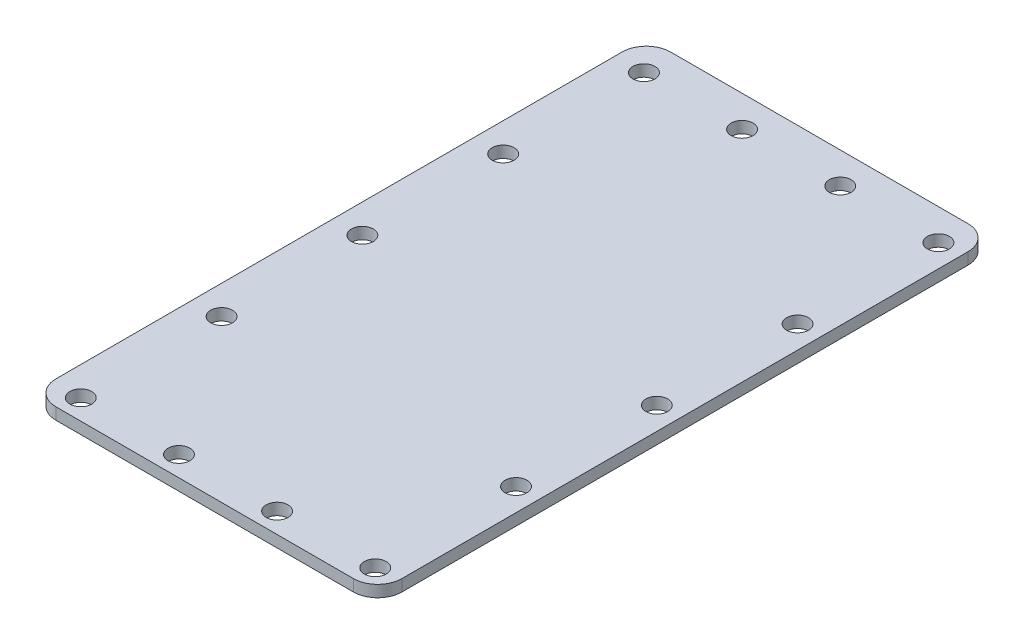
ISO-10303-21;
HEADER;
FILE_DESCRIPTION(('STEP AP214'),'2;1');
FILE_NAME('part.step','',(''),(''),'','','');
FILE_SCHEMA(('AUTOMOTIVE_DESIGN { 1 0 10303 214 1 1 1 1 }'));
ENDSEC;
DATA;
#1=APPLICATION_CONTEXT('core data for automotive mechanical design processes');
#2=APPLICATION_PROTOCOL_DEFINITION('international standard','automotive_design',2000,#1);
#3=PRODUCT_CONTEXT('',#1,'mechanical');
#4=PRODUCT('Part','Part','',(#3));
#5=PRODUCT_RELATED_PRODUCT_CATEGORY('part','',(#4));
#6=PRODUCT_DEFINITION_FORMATION('','',#4);
#7=PRODUCT_DEFINITION_CONTEXT('part definition',#1,'design');
#8=PRODUCT_DEFINITION('design','',#6,#7);
#9=PRODUCT_DEFINITION_SHAPE('','',#8);
#10=(LENGTH_UNIT() NAMED_UNIT(*) SI_UNIT(.MILLI.,.METRE.));
#11=(NAMED_UNIT(*) PLANE_ANGLE_UNIT() SI_UNIT($,.RADIAN.));
#12=(NAMED_UNIT(*) SI_UNIT($,.STERADIAN.) SOLID_ANGLE_UNIT());
#13=UNCERTAINTY_MEASURE_WITH_UNIT(LENGTH_MEASURE(1.E-05),#10,'distance_accuracy_value','');
#14=(GEOMETRIC_REPRESENTATION_CONTEXT(3) GLOBAL_UNCERTAINTY_ASSIGNED_CONTEXT((#13)) GLOBAL_UNIT_ASSIGNED_CONTEXT((#10,
#11,#12)) REPRESENTATION_CONTEXT('',''));
#15=CARTESIAN_POINT('',(0.,0.,0.));
#16=DIRECTION('',(0.,0.,1.));
#17=DIRECTION('',(1.,0.,0.));
#18=AXIS2_PLACEMENT_3D('',#15,#16,#17);
#19=CARTESIAN_POINT('',(-61.2,-4.8,-116.5));
#20=DIRECTION('',(0.,1.,0.));
#21=DIRECTION('',(0.,0.,1.));
#22=AXIS2_PLACEMENT_3D('',#19,#20,#21);
#23=CYLINDRICAL_SURFACE('',#22,9.99999999999999);
#24=CARTESIAN_POINT('',(-61.2,0.,-116.5));
#25=DIRECTION('',(0.,1.,0.));
#26=DIRECTION('',(0.,0.,1.));
#27=AXIS2_PLACEMENT_3D('',#24,#25,#26);
#28=CIRCLE('',#27,9.99999999999999);
#29=CARTESIAN_POINT('',(-61.1999999999999,0.,-126.5));
#30=VERTEX_POINT('',#29);
#31=CARTESIAN_POINT('',(-71.2,0.,-116.5));
#32=VERTEX_POINT('',#31);
#33=EDGE_CURVE('E138',#30,#32,#28,.T.);
#34=ORIENTED_EDGE('',*,*,#33,.F.);
#35=DIRECTION('',(0.,1.,0.));
#36=VECTOR('',#35,1.);
#37=CARTESIAN_POINT('',(-61.1999999999999,-4.8,-126.5));
#38=LINE('',#37,#36);
#39=CARTESIAN_POINT('',(-61.1999999999999,-4.8,-126.5));
#40=VERTEX_POINT('',#39);
#41=EDGE_CURVE('E11',#40,#30,#38,.T.);
#42=ORIENTED_EDGE('',*,*,#41,.F.);
#43=CARTESIAN_POINT('',(-61.2,-4.8,-116.5));
#44=DIRECTION('',(0.,1.,0.));
#45=DIRECTION('',(0.,0.,1.));
#46=AXIS2_PLACEMENT_3D('',#43,#44,#45);
#47=CIRCLE('',#46,9.99999999999999);
#48=CARTESIAN_POINT('',(-71.2,-4.8,-116.5));
#49=VERTEX_POINT('',#48);
#50=EDGE_CURVE('E159',#40,#49,#47,.T.);
#51=ORIENTED_EDGE('',*,*,#50,.T.);
#52=DIRECTION('',(0.,1.,0.));
#53=VECTOR('',#52,1.);
#54=CARTESIAN_POINT('',(-71.2,-4.8,-116.5));
#55=LINE('',#54,#53);
#56=EDGE_CURVE('E44',#49,#32,#55,.T.);
#57=ORIENTED_EDGE('',*,*,#56,.T.);
#58=EDGE_LOOP('',(#34,#42,#51,#57));
#59=FACE_BOUND('',#58,.T.);
#60=ADVANCED_FACE('F41',(#59),#23,.T.);
#61=CARTESIAN_POINT('',(-61.1999999999999,-4.8,-126.5));
#62=DIRECTION('',(0.,0.,-1.));
#63=DIRECTION('',(-1.,0.,0.));
#64=AXIS2_PLACEMENT_3D('',#61,#62,#63);
#65=PLANE('',#64);
#66=DIRECTION('',(-1.,0.,0.));
#67=VECTOR('',#66,1.);
#68=CARTESIAN_POINT('',(-61.1999999999999,0.,-126.5));
#69=LINE('',#68,#67);
#70=CARTESIAN_POINT('',(61.1999999999999,0.,-126.5));
#71=VERTEX_POINT('',#70);
#72=EDGE_CURVE('E157',#71,#30,#69,.T.);
#73=ORIENTED_EDGE('',*,*,#72,.F.);
#74=DIRECTION('',(0.,1.,0.));
#75=VECTOR('',#74,1.);
#76=CARTESIAN_POINT('',(61.1999999999999,-4.8,-126.5));
#77=LINE('',#76,#75);
#78=CARTESIAN_POINT('',(61.1999999999999,-4.8,-126.5));
#79=VERTEX_POINT('',#78);
#80=EDGE_CURVE('E50',#79,#71,#77,.T.);
#81=ORIENTED_EDGE('',*,*,#80,.F.);
#82=DIRECTION('',(-1.,0.,0.));
#83=VECTOR('',#82,1.);
#84=CARTESIAN_POINT('',(-61.1999999999999,-4.8,-126.5));
#85=LINE('',#84,#83);
#86=EDGE_CURVE('E128',#79,#40,#85,.T.);
#87=ORIENTED_EDGE('',*,*,#86,.T.);
#88=ORIENTED_EDGE('',*,*,#41,.T.);
#89=EDGE_LOOP('',(#73,#81,#87,#88));
#90=FACE_BOUND('',#89,.T.);
#91=ADVANCED_FACE('F171',(#90),#65,.T.);
#92=CARTESIAN_POINT('',(61.2,-4.8,-116.5));
#93=DIRECTION('',(0.,1.,0.));
#94=DIRECTION('',(0.,0.,1.));
#95=AXIS2_PLACEMENT_3D('',#92,#93,#94);
#96=CYLINDRICAL_SURFACE('',#95,10.);
#97=CARTESIAN_POINT('',(61.2,0.,-116.5));
#98=DIRECTION('',(0.,1.,0.));
#99=DIRECTION('',(0.,0.,1.));
#100=AXIS2_PLACEMENT_3D('',#97,#98,#99);
#101=CIRCLE('',#100,10.);
#102=CARTESIAN_POINT('',(71.2,0.,-116.5));
#103=VERTEX_POINT('',#102);
#104=EDGE_CURVE('E115',#103,#71,#101,.T.);
#105=ORIENTED_EDGE('',*,*,#104,.F.);
#106=DIRECTION('',(0.,1.,0.));
#107=VECTOR('',#106,1.);
#108=CARTESIAN_POINT('',(71.2,-4.8,-116.5));
#109=LINE('',#108,#107);
#110=CARTESIAN_POINT('',(71.2,-4.8,-116.5));
#111=VERTEX_POINT('',#110);
#112=EDGE_CURVE('E110',#111,#103,#109,.T.);
#113=ORIENTED_EDGE('',*,*,#112,.F.);
#114=CARTESIAN_POINT('',(61.2,-4.8,-116.5));
#115=DIRECTION('',(0.,1.,0.));
#116=DIRECTION('',(0.,0.,1.));
#117=AXIS2_PLACEMENT_3D('',#114,#115,#116);
#118=CIRCLE('',#117,10.);
#119=EDGE_CURVE('E113',#111,#79,#118,.T.);
#120=ORIENTED_EDGE('',*,*,#119,.T.);
#121=ORIENTED_EDGE('',*,*,#80,.T.);
#122=EDGE_LOOP('',(#105,#113,#120,#121));
#123=FACE_BOUND('',#122,.T.);
#124=ADVANCED_FACE('F112',(#123),#96,.T.);
#125=CARTESIAN_POINT('',(71.2,-4.8,116.5));
#126=DIRECTION('',(1.,0.,0.));
#127=DIRECTION('',(0.,0.,-1.));
#128=AXIS2_PLACEMENT_3D('',#125,#126,#127);
#129=PLANE('',#128);
#130=DIRECTION('',(0.,0.,-1.));
#131=VECTOR('',#130,1.);
#132=CARTESIAN_POINT('',(71.2,0.,116.5));
#133=LINE('',#132,#131);
#134=CARTESIAN_POINT('',(71.2,0.,116.5));
#135=VERTEX_POINT('',#134);
#136=EDGE_CURVE('E154',#135,#103,#133,.T.);
#137=ORIENTED_EDGE('',*,*,#136,.F.);
#138=DIRECTION('',(0.,1.,0.));
#139=VECTOR('',#138,1.);
#140=CARTESIAN_POINT('',(71.2,-4.8,116.5));
#141=LINE('',#140,#139);
#142=CARTESIAN_POINT('',(71.2,-4.8,116.5));
#143=VERTEX_POINT('',#142);
#144=EDGE_CURVE('E120',#143,#135,#141,.T.);
#145=ORIENTED_EDGE('',*,*,#144,.F.);
#146=DIRECTION('',(0.,0.,-1.));
#147=VECTOR('',#146,1.);
#148=CARTESIAN_POINT('',(71.2,-4.8,116.5));
#149=LINE('',#148,#147);
#150=EDGE_CURVE('E126',#143,#111,#149,.T.);
#151=ORIENTED_EDGE('',*,*,#150,.T.);
#152=ORIENTED_EDGE('',*,*,#112,.T.);
#153=EDGE_LOOP('',(#137,#145,#151,#152));
#154=FACE_BOUND('',#153,.T.);
#155=ADVANCED_FACE('F130',(#154),#129,.T.);
#156=CARTESIAN_POINT('',(61.2,-4.8,116.5));
#157=DIRECTION('',(0.,1.,0.));
#158=DIRECTION('',(0.,0.,1.));
#159=AXIS2_PLACEMENT_3D('',#156,#157,#158);
#160=CYLINDRICAL_SURFACE('',#159,9.99999999999999);
#161=CARTESIAN_POINT('',(61.2,0.,116.5));
#162=DIRECTION('',(0.,1.,0.));
#163=DIRECTION('',(0.,0.,1.));
#164=AXIS2_PLACEMENT_3D('',#161,#162,#163);
#165=CIRCLE('',#164,9.99999999999999);
#166=CARTESIAN_POINT('',(61.1999999999999,0.,126.5));
#167=VERTEX_POINT('',#166);
#168=EDGE_CURVE('E151',#167,#135,#165,.T.);
#169=ORIENTED_EDGE('',*,*,#168,.F.);
#170=DIRECTION('',(0.,1.,0.));
#171=VECTOR('',#170,1.);
#172=CARTESIAN_POINT('',(61.1999999999999,-4.8,126.5));
#173=LINE('',#172,#171);
#174=CARTESIAN_POINT('',(61.1999999999999,-4.8,126.5));
#175=VERTEX_POINT('',#174);
#176=EDGE_CURVE('E163',#175,#167,#173,.T.);
#177=ORIENTED_EDGE('',*,*,#176,.F.);
#178=CARTESIAN_POINT('',(61.2,-4.8,116.5));
#179=DIRECTION('',(0.,1.,0.));
#180=DIRECTION('',(0.,0.,1.));
#181=AXIS2_PLACEMENT_3D('',#178,#179,#180);
#182=CIRCLE('',#181,9.99999999999999);
#183=EDGE_CURVE('E131',#175,#143,#182,.T.);
#184=ORIENTED_EDGE('',*,*,#183,.T.);
#185=ORIENTED_EDGE('',*,*,#144,.T.);
#186=EDGE_LOOP('',(#169,#177,#184,#185));
#187=FACE_BOUND('',#186,.T.);
#188=ADVANCED_FACE('F184',(#187),#160,.T.);
#189=CARTESIAN_POINT('',(-61.1999999999999,-4.8,126.5));
#190=DIRECTION('',(0.,0.,1.));
#191=DIRECTION('',(1.,0.,0.));
#192=AXIS2_PLACEMENT_3D('',#189,#190,#191);
#193=PLANE('',#192);
#194=DIRECTION('',(1.,0.,0.));
#195=VECTOR('',#194,1.);
#196=CARTESIAN_POINT('',(-61.1999999999999,0.,126.5));
#197=LINE('',#196,#195);
#198=CARTESIAN_POINT('',(-61.1999999999999,0.,126.5));
#199=VERTEX_POINT('',#198);
#200=EDGE_CURVE('E148',#199,#167,#197,.T.);
#201=ORIENTED_EDGE('',*,*,#200,.F.);
#202=DIRECTION('',(0.,1.,0.));
#203=VECTOR('',#202,1.);
#204=CARTESIAN_POINT('',(-61.1999999999999,-4.8,126.5));
#205=LINE('',#204,#203);
#206=CARTESIAN_POINT('',(-61.1999999999999,-4.8,126.5));
#207=VERTEX_POINT('',#206);
#208=EDGE_CURVE('E165',#207,#199,#205,.T.);
#209=ORIENTED_EDGE('',*,*,#208,.F.);
#210=DIRECTION('',(1.,0.,0.));
#211=VECTOR('',#210,1.);
#212=CARTESIAN_POINT('',(-61.1999999999999,-4.8,126.5));
#213=LINE('',#212,#211);
#214=EDGE_CURVE('E133',#207,#175,#213,.T.);
#215=ORIENTED_EDGE('',*,*,#214,.T.);
#216=ORIENTED_EDGE('',*,*,#176,.T.);
#217=EDGE_LOOP('',(#201,#209,#215,#216));
#218=FACE_BOUND('',#217,.T.);
#219=ADVANCED_FACE('F187',(#218),#193,.T.);
#220=CARTESIAN_POINT('',(-61.2,-4.8,116.5));
#221=DIRECTION('',(0.,1.,0.));
#222=DIRECTION('',(0.,0.,1.));
#223=AXIS2_PLACEMENT_3D('',#220,#221,#222);
#224=CYLINDRICAL_SURFACE('',#223,10.);
#225=CARTESIAN_POINT('',(-61.2,0.,116.5));
#226=DIRECTION('',(0.,1.,0.));
#227=DIRECTION('',(0.,0.,1.));
#228=AXIS2_PLACEMENT_3D('',#225,#226,#227);
#229=CIRCLE('',#228,10.);
#230=CARTESIAN_POINT('',(-71.2,0.,116.5));
#231=VERTEX_POINT('',#230);
#232=EDGE_CURVE('E145',#231,#199,#229,.T.);
#233=ORIENTED_EDGE('',*,*,#232,.F.);
#234=DIRECTION('',(0.,1.,0.));
#235=VECTOR('',#234,1.);
#236=CARTESIAN_POINT('',(-71.2,-4.8,116.5));
#237=LINE('',#236,#235);
#238=CARTESIAN_POINT('',(-71.2,-4.8,116.5));
#239=VERTEX_POINT('',#238);
#240=EDGE_CURVE('E166',#239,#231,#237,.T.);
#241=ORIENTED_EDGE('',*,*,#240,.F.);
#242=CARTESIAN_POINT('',(-61.2,-4.8,116.5));
#243=DIRECTION('',(0.,1.,0.));
#244=DIRECTION('',(0.,0.,1.));
#245=AXIS2_PLACEMENT_3D('',#242,#243,#244);
#246=CIRCLE('',#245,10.);
#247=EDGE_CURVE('E353',#239,#207,#246,.T.);
#248=ORIENTED_EDGE('',*,*,#247,.T.);
#249=ORIENTED_EDGE('',*,*,#208,.T.);
#250=EDGE_LOOP('',(#233,#241,#248,#249));
#251=FACE_BOUND('',#250,.T.);
#252=ADVANCED_FACE('F191',(#251),#224,.T.);
#253=CARTESIAN_POINT('',(-71.2,-4.8,116.5));
#254=DIRECTION('',(-1.,0.,0.));
#255=DIRECTION('',(0.,0.,1.));
#256=AXIS2_PLACEMENT_3D('',#253,#254,#255);
#257=PLANE('',#256);
#258=DIRECTION('',(0.,0.,1.));
#259=VECTOR('',#258,1.);
#260=CARTESIAN_POINT('',(-71.2,0.,116.5));
#261=LINE('',#260,#259);
#262=EDGE_CURVE('E141',#32,#231,#261,.T.);
#263=ORIENTED_EDGE('',*,*,#262,.F.);
#264=ORIENTED_EDGE('',*,*,#56,.F.);
#265=DIRECTION('',(0.,0.,1.));
#266=VECTOR('',#265,1.);
#267=CARTESIAN_POINT('',(-71.2,-4.8,116.5));
#268=LINE('',#267,#266);
#269=EDGE_CURVE('E351',#49,#239,#268,.T.);
#270=ORIENTED_EDGE('',*,*,#269,.T.);
#271=ORIENTED_EDGE('',*,*,#240,.T.);
#272=EDGE_LOOP('',(#263,#264,#270,#271));
#273=FACE_BOUND('',#272,.T.);
#274=ADVANCED_FACE('F168',(#273),#257,.T.);
#275=CARTESIAN_POINT('',(-61.2,-4.8,-116.5));
#276=DIRECTION('',(0.,1.,0.));
#277=DIRECTION('',(0.,0.,1.));
#278=AXIS2_PLACEMENT_3D('',#275,#276,#277);
#279=PLANE('',#278);
#280=CARTESIAN_POINT('',(-59.3236636399737,-4.8,-55.6823518322567));
#281=DIRECTION('',(0.,1.,0.));
#282=DIRECTION('',(0.,0.,-1.));
#283=AXIS2_PLACEMENT_3D('',#280,#281,#282);
#284=CIRCLE('',#283,4.50000000000001);
#285=CARTESIAN_POINT('',(-59.3236636399737,-4.8,-60.1823518322567));
#286=VERTEX_POINT('',#285);
#287=EDGE_CURVE('E266',#286,#286,#284,.T.);
#288=ORIENTED_EDGE('',*,*,#287,.T.);
#289=EDGE_LOOP('',(#288));
#290=FACE_BOUND('',#289,.T.);
#291=CARTESIAN_POINT('',(-59.3236636399737,-4.8,2.26764816774334));
#292=DIRECTION('',(0.,1.,0.));
#293=DIRECTION('',(0.,0.,-1.));
#294=AXIS2_PLACEMENT_3D('',#291,#292,#293);
#295=CIRCLE('',#294,4.49999999999999);
#296=CARTESIAN_POINT('',(-59.3236636399737,-4.8,-2.23235183225665));
#297=VERTEX_POINT('',#296);
#298=EDGE_CURVE('E274',#297,#297,#295,.T.);
#299=ORIENTED_EDGE('',*,*,#298,.T.);
#300=EDGE_LOOP('',(#299));
#301=FACE_BOUND('',#300,.T.);
#302=CARTESIAN_POINT('',(-59.3236636399737,-4.8,60.2176481677433));
#303=DIRECTION('',(0.,1.,0.));
#304=DIRECTION('',(0.,0.,-1.));
#305=AXIS2_PLACEMENT_3D('',#302,#303,#304);
#306=CIRCLE('',#305,4.50000000000001);
#307=CARTESIAN_POINT('',(-59.3236636399737,-4.8,55.7176481677433));
#308=VERTEX_POINT('',#307);
#309=EDGE_CURVE('E280',#308,#308,#306,.T.);
#310=ORIENTED_EDGE('',*,*,#309,.T.);
#311=EDGE_LOOP('',(#310));
#312=FACE_BOUND('',#311,.T.);
#313=CARTESIAN_POINT('',(-18.9236636399737,-4.8,118.167648167743));
#314=DIRECTION('',(0.,1.,0.));
#315=DIRECTION('',(0.,0.,-1.));
#316=AXIS2_PLACEMENT_3D('',#313,#314,#315);
#317=CIRCLE('',#316,4.5);
#318=CARTESIAN_POINT('',(-18.9236636399737,-4.8,113.667648167743));
#319=VERTEX_POINT('',#318);
#320=EDGE_CURVE('E286',#319,#319,#317,.T.);
#321=ORIENTED_EDGE('',*,*,#320,.T.);
#322=EDGE_LOOP('',(#321));
#323=FACE_BOUND('',#322,.T.);
#324=CARTESIAN_POINT('',(21.4763363600263,-4.8,118.167648167743));
#325=DIRECTION('',(0.,1.,0.));
#326=DIRECTION('',(0.,0.,-1.));
#327=AXIS2_PLACEMENT_3D('',#324,#325,#326);
#328=CIRCLE('',#327,4.5);
#329=CARTESIAN_POINT('',(21.4763363600263,-4.8,113.667648167743));
#330=VERTEX_POINT('',#329);
#331=EDGE_CURVE('E292',#330,#330,#328,.T.);
#332=ORIENTED_EDGE('',*,*,#331,.T.);
#333=EDGE_LOOP('',(#332));
#334=FACE_BOUND('',#333,.T.);
#335=CARTESIAN_POINT('',(61.8763363600263,-4.8,60.2176481677433));
#336=DIRECTION('',(0.,1.,0.));
#337=DIRECTION('',(0.,0.,1.));
#338=AXIS2_PLACEMENT_3D('',#335,#336,#337);
#339=CIRCLE('',#338,4.5);
#340=CARTESIAN_POINT('',(61.8763363600263,-4.8,64.7176481677433));
#341=VERTEX_POINT('',#340);
#342=EDGE_CURVE('E298',#341,#341,#339,.T.);
#343=ORIENTED_EDGE('',*,*,#342,.T.);
#344=EDGE_LOOP('',(#343));
#345=FACE_BOUND('',#344,.T.);
#346=CARTESIAN_POINT('',(61.8763363600263,-4.8,2.26764816774334));
#347=DIRECTION('',(0.,1.,0.));
#348=DIRECTION('',(0.,0.,1.));
#349=AXIS2_PLACEMENT_3D('',#346,#347,#348);
#350=CIRCLE('',#349,4.5);
#351=CARTESIAN_POINT('',(61.8763363600263,-4.8,6.76764816774335));
#352=VERTEX_POINT('',#351);
#353=EDGE_CURVE('E304',#352,#352,#350,.T.);
#354=ORIENTED_EDGE('',*,*,#353,.T.);
#355=EDGE_LOOP('',(#354));
#356=FACE_BOUND('',#355,.T.);
#357=CARTESIAN_POINT('',(61.8763363600263,-4.8,-55.6823518322567));
#358=DIRECTION('',(0.,1.,0.));
#359=DIRECTION('',(0.,0.,1.));
#360=AXIS2_PLACEMENT_3D('',#357,#358,#359);
#361=CIRCLE('',#360,4.50000000000001);
#362=CARTESIAN_POINT('',(61.8763363600263,-4.8,-51.1823518322566));
#363=VERTEX_POINT('',#362);
#364=EDGE_CURVE('E310',#363,#363,#361,.T.);
#365=ORIENTED_EDGE('',*,*,#364,.T.);
#366=EDGE_LOOP('',(#365));
#367=FACE_BOUND('',#366,.T.);
#368=CARTESIAN_POINT('',(21.4763363600263,-4.8,-113.632351832257));
#369=DIRECTION('',(0.,1.,0.));
#370=DIRECTION('',(0.,0.,1.));
#371=AXIS2_PLACEMENT_3D('',#368,#369,#370);
#372=CIRCLE('',#371,4.5);
#373=CARTESIAN_POINT('',(21.4763363600263,-4.8,-109.132351832257));
#374=VERTEX_POINT('',#373);
#375=EDGE_CURVE('E316',#374,#374,#372,.T.);
#376=ORIENTED_EDGE('',*,*,#375,.T.);
#377=EDGE_LOOP('',(#376));
#378=FACE_BOUND('',#377,.T.);
#379=CARTESIAN_POINT('',(-18.9236636399737,-4.8,-113.632351832257));
#380=DIRECTION('',(0.,1.,0.));
#381=DIRECTION('',(0.,0.,1.));
#382=AXIS2_PLACEMENT_3D('',#379,#380,#381);
#383=CIRCLE('',#382,4.5);
#384=CARTESIAN_POINT('',(-18.9236636399737,-4.8,-109.132351832257));
#385=VERTEX_POINT('',#384);
#386=EDGE_CURVE('E322',#385,#385,#383,.T.);
#387=ORIENTED_EDGE('',*,*,#386,.T.);
#388=EDGE_LOOP('',(#387));
#389=FACE_BOUND('',#388,.T.);
#390=CARTESIAN_POINT('',(61.8763363600263,-4.8,118.167648167743));
#391=DIRECTION('',(0.,1.,0.));
#392=DIRECTION('',(0.,0.,1.));
#393=AXIS2_PLACEMENT_3D('',#390,#391,#392);
#394=CIRCLE('',#393,4.50000000000001);
#395=CARTESIAN_POINT('',(61.8763363600263,-4.8,122.667648167743));
#396=VERTEX_POINT('',#395);
#397=EDGE_CURVE('E328',#396,#396,#394,.T.);
#398=ORIENTED_EDGE('',*,*,#397,.T.);
#399=EDGE_LOOP('',(#398));
#400=FACE_BOUND('',#399,.T.);
#401=CARTESIAN_POINT('',(-59.3236636399737,-4.8,118.167648167743));
#402=DIRECTION('',(0.,1.,0.));
#403=DIRECTION('',(0.,0.,1.));
#404=AXIS2_PLACEMENT_3D('',#401,#402,#403);
#405=CIRCLE('',#404,4.5);
#406=CARTESIAN_POINT('',(-59.3236636399737,-4.8,122.667648167743));
#407=VERTEX_POINT('',#406);
#408=EDGE_CURVE('E334',#407,#407,#405,.T.);
#409=ORIENTED_EDGE('',*,*,#408,.T.);
#410=EDGE_LOOP('',(#409));
#411=FACE_BOUND('',#410,.T.);
#412=CARTESIAN_POINT('',(61.8763363600263,-4.8,-113.632351832257));
#413=DIRECTION('',(0.,1.,0.));
#414=DIRECTION('',(0.,0.,1.));
#415=AXIS2_PLACEMENT_3D('',#412,#413,#414);
#416=CIRCLE('',#415,4.50000000000001);
#417=CARTESIAN_POINT('',(61.8763363600263,-4.8,-109.132351832257));
#418=VERTEX_POINT('',#417);
#419=EDGE_CURVE('E340',#418,#418,#416,.T.);
#420=ORIENTED_EDGE('',*,*,#419,.T.);
#421=EDGE_LOOP('',(#420));
#422=FACE_BOUND('',#421,.T.);
#423=CARTESIAN_POINT('',(-59.3236636399737,-4.8,-113.632351832257));
#424=DIRECTION('',(0.,1.,0.));
#425=DIRECTION('',(0.,0.,1.));
#426=AXIS2_PLACEMENT_3D('',#423,#424,#425);
#427=CIRCLE('',#426,4.5);
#428=CARTESIAN_POINT('',(-59.3236636399737,-4.8,-109.132351832257));
#429=VERTEX_POINT('',#428);
#430=EDGE_CURVE('E142',#429,#429,#427,.T.);
#431=ORIENTED_EDGE('',*,*,#430,.T.);
#432=EDGE_LOOP('',(#431));
#433=FACE_BOUND('',#432,.T.);
#434=ORIENTED_EDGE('',*,*,#50,.F.);
#435=ORIENTED_EDGE('',*,*,#86,.F.);
#436=ORIENTED_EDGE('',*,*,#119,.F.);
#437=ORIENTED_EDGE('',*,*,#150,.F.);
#438=ORIENTED_EDGE('',*,*,#183,.F.);
#439=ORIENTED_EDGE('',*,*,#214,.F.);
#440=ORIENTED_EDGE('',*,*,#247,.F.);
#441=ORIENTED_EDGE('',*,*,#269,.F.);
#442=EDGE_LOOP('',(#434,#435,#436,#437,#438,#439,#440,#441));
#443=FACE_BOUND('',#442,.T.);
#444=ADVANCED_FACE('F124',(#290,#301,#312,#323,#334,#345,#356,#367,#378,#389,#400,#411,#422,
#433,#443),#279,.F.);
#445=CARTESIAN_POINT('',(-61.2,0.,-116.5));
#446=DIRECTION('',(0.,1.,0.));
#447=DIRECTION('',(0.,0.,1.));
#448=AXIS2_PLACEMENT_3D('',#445,#446,#447);
#449=PLANE('',#448);
#450=CARTESIAN_POINT('',(-59.3236636399737,0.,-55.6823518322567));
#451=DIRECTION('',(0.,1.,0.));
#452=DIRECTION('',(0.,0.,-1.));
#453=AXIS2_PLACEMENT_3D('',#450,#451,#452);
#454=CIRCLE('',#453,4.50000000000001);
#455=CARTESIAN_POINT('',(-59.3236636399737,0.,-60.1823518322567));
#456=VERTEX_POINT('',#455);
#457=EDGE_CURVE('E269',#456,#456,#454,.T.);
#458=ORIENTED_EDGE('',*,*,#457,.F.);
#459=EDGE_LOOP('',(#458));
#460=FACE_BOUND('',#459,.T.);
#461=CARTESIAN_POINT('',(-59.3236636399737,0.,2.26764816774334));
#462=DIRECTION('',(0.,1.,0.));
#463=DIRECTION('',(0.,0.,-1.));
#464=AXIS2_PLACEMENT_3D('',#461,#462,#463);
#465=CIRCLE('',#464,4.49999999999999);
#466=CARTESIAN_POINT('',(-59.3236636399737,0.,-2.23235183225665));
#467=VERTEX_POINT('',#466);
#468=EDGE_CURVE('E271',#467,#467,#465,.T.);
#469=ORIENTED_EDGE('',*,*,#468,.F.);
#470=EDGE_LOOP('',(#469));
#471=FACE_BOUND('',#470,.T.);
#472=CARTESIAN_POINT('',(-59.3236636399737,0.,60.2176481677433));
#473=DIRECTION('',(0.,1.,0.));
#474=DIRECTION('',(0.,0.,-1.));
#475=AXIS2_PLACEMENT_3D('',#472,#473,#474);
#476=CIRCLE('',#475,4.50000000000001);
#477=CARTESIAN_POINT('',(-59.3236636399737,0.,55.7176481677433));
#478=VERTEX_POINT('',#477);
#479=EDGE_CURVE('E277',#478,#478,#476,.T.);
#480=ORIENTED_EDGE('',*,*,#479,.F.);
#481=EDGE_LOOP('',(#480));
#482=FACE_BOUND('',#481,.T.);
#483=CARTESIAN_POINT('',(-18.9236636399737,0.,118.167648167743));
#484=DIRECTION('',(0.,1.,0.));
#485=DIRECTION('',(0.,0.,-1.));
#486=AXIS2_PLACEMENT_3D('',#483,#484,#485);
#487=CIRCLE('',#486,4.5);
#488=CARTESIAN_POINT('',(-18.9236636399737,0.,113.667648167743));
#489=VERTEX_POINT('',#488);
#490=EDGE_CURVE('E283',#489,#489,#487,.T.);
#491=ORIENTED_EDGE('',*,*,#490,.F.);
#492=EDGE_LOOP('',(#491));
#493=FACE_BOUND('',#492,.T.);
#494=CARTESIAN_POINT('',(21.4763363600263,0.,118.167648167743));
#495=DIRECTION('',(0.,1.,0.));
#496=DIRECTION('',(0.,0.,-1.));
#497=AXIS2_PLACEMENT_3D('',#494,#495,#496);
#498=CIRCLE('',#497,4.5);
#499=CARTESIAN_POINT('',(21.4763363600263,0.,113.667648167743));
#500=VERTEX_POINT('',#499);
#501=EDGE_CURVE('E289',#500,#500,#498,.T.);
#502=ORIENTED_EDGE('',*,*,#501,.F.);
#503=EDGE_LOOP('',(#502));
#504=FACE_BOUND('',#503,.T.);
#505=CARTESIAN_POINT('',(61.8763363600263,0.,60.2176481677433));
#506=DIRECTION('',(0.,1.,0.));
#507=DIRECTION('',(0.,0.,1.));
#508=AXIS2_PLACEMENT_3D('',#505,#506,#507);
#509=CIRCLE('',#508,4.5);
#510=CARTESIAN_POINT('',(61.8763363600263,0.,64.7176481677433));
#511=VERTEX_POINT('',#510);
#512=EDGE_CURVE('E295',#511,#511,#509,.T.);
#513=ORIENTED_EDGE('',*,*,#512,.F.);
#514=EDGE_LOOP('',(#513));
#515=FACE_BOUND('',#514,.T.);
#516=CARTESIAN_POINT('',(61.8763363600263,0.,2.26764816774334));
#517=DIRECTION('',(0.,1.,0.));
#518=DIRECTION('',(0.,0.,1.));
#519=AXIS2_PLACEMENT_3D('',#516,#517,#518);
#520=CIRCLE('',#519,4.5);
#521=CARTESIAN_POINT('',(61.8763363600263,0.,6.76764816774335));
#522=VERTEX_POINT('',#521);
#523=EDGE_CURVE('E301',#522,#522,#520,.T.);
#524=ORIENTED_EDGE('',*,*,#523,.F.);
#525=EDGE_LOOP('',(#524));
#526=FACE_BOUND('',#525,.T.);
#527=CARTESIAN_POINT('',(61.8763363600263,0.,-55.6823518322567));
#528=DIRECTION('',(0.,1.,0.));
#529=DIRECTION('',(0.,0.,1.));
#530=AXIS2_PLACEMENT_3D('',#527,#528,#529);
#531=CIRCLE('',#530,4.50000000000001);
#532=CARTESIAN_POINT('',(61.8763363600263,0.,-51.1823518322566));
#533=VERTEX_POINT('',#532);
#534=EDGE_CURVE('E307',#533,#533,#531,.T.);
#535=ORIENTED_EDGE('',*,*,#534,.F.);
#536=EDGE_LOOP('',(#535));
#537=FACE_BOUND('',#536,.T.);
#538=CARTESIAN_POINT('',(21.4763363600263,0.,-113.632351832257));
#539=DIRECTION('',(0.,1.,0.));
#540=DIRECTION('',(0.,0.,1.));
#541=AXIS2_PLACEMENT_3D('',#538,#539,#540);
#542=CIRCLE('',#541,4.5);
#543=CARTESIAN_POINT('',(21.4763363600263,0.,-109.132351832257));
#544=VERTEX_POINT('',#543);
#545=EDGE_CURVE('E313',#544,#544,#542,.T.);
#546=ORIENTED_EDGE('',*,*,#545,.F.);
#547=EDGE_LOOP('',(#546));
#548=FACE_BOUND('',#547,.T.);
#549=CARTESIAN_POINT('',(-18.9236636399737,0.,-113.632351832257));
#550=DIRECTION('',(0.,1.,0.));
#551=DIRECTION('',(0.,0.,1.));
#552=AXIS2_PLACEMENT_3D('',#549,#550,#551);
#553=CIRCLE('',#552,4.5);
#554=CARTESIAN_POINT('',(-18.9236636399737,0.,-109.132351832257));
#555=VERTEX_POINT('',#554);
#556=EDGE_CURVE('E319',#555,#555,#553,.T.);
#557=ORIENTED_EDGE('',*,*,#556,.F.);
#558=EDGE_LOOP('',(#557));
#559=FACE_BOUND('',#558,.T.);
#560=CARTESIAN_POINT('',(61.8763363600263,0.,118.167648167743));
#561=DIRECTION('',(0.,1.,0.));
#562=DIRECTION('',(0.,0.,1.));
#563=AXIS2_PLACEMENT_3D('',#560,#561,#562);
#564=CIRCLE('',#563,4.50000000000001);
#565=CARTESIAN_POINT('',(61.8763363600263,0.,122.667648167743));
#566=VERTEX_POINT('',#565);
#567=EDGE_CURVE('E325',#566,#566,#564,.T.);
#568=ORIENTED_EDGE('',*,*,#567,.F.);
#569=EDGE_LOOP('',(#568));
#570=FACE_BOUND('',#569,.T.);
#571=CARTESIAN_POINT('',(-59.3236636399737,0.,118.167648167743));
#572=DIRECTION('',(0.,1.,0.));
#573=DIRECTION('',(0.,0.,1.));
#574=AXIS2_PLACEMENT_3D('',#571,#572,#573);
#575=CIRCLE('',#574,4.5);
#576=CARTESIAN_POINT('',(-59.3236636399737,0.,122.667648167743));
#577=VERTEX_POINT('',#576);
#578=EDGE_CURVE('E331',#577,#577,#575,.T.);
#579=ORIENTED_EDGE('',*,*,#578,.F.);
#580=EDGE_LOOP('',(#579));
#581=FACE_BOUND('',#580,.T.);
#582=CARTESIAN_POINT('',(61.8763363600263,0.,-113.632351832257));
#583=DIRECTION('',(0.,1.,0.));
#584=DIRECTION('',(0.,0.,1.));
#585=AXIS2_PLACEMENT_3D('',#582,#583,#584);
#586=CIRCLE('',#585,4.50000000000001);
#587=CARTESIAN_POINT('',(61.8763363600263,0.,-109.132351832257));
#588=VERTEX_POINT('',#587);
#589=EDGE_CURVE('E337',#588,#588,#586,.T.);
#590=ORIENTED_EDGE('',*,*,#589,.F.);
#591=EDGE_LOOP('',(#590));
#592=FACE_BOUND('',#591,.T.);
#593=CARTESIAN_POINT('',(-59.3236636399737,0.,-113.632351832257));
#594=DIRECTION('',(0.,1.,0.));
#595=DIRECTION('',(0.,0.,1.));
#596=AXIS2_PLACEMENT_3D('',#593,#594,#595);
#597=CIRCLE('',#596,4.5);
#598=CARTESIAN_POINT('',(-59.3236636399737,0.,-109.132351832257));
#599=VERTEX_POINT('',#598);
#600=EDGE_CURVE('E343',#599,#599,#597,.T.);
#601=ORIENTED_EDGE('',*,*,#600,.F.);
#602=EDGE_LOOP('',(#601));
#603=FACE_BOUND('',#602,.T.);
#604=ORIENTED_EDGE('',*,*,#33,.T.);
#605=ORIENTED_EDGE('',*,*,#262,.T.);
#606=ORIENTED_EDGE('',*,*,#232,.T.);
#607=ORIENTED_EDGE('',*,*,#200,.T.);
#608=ORIENTED_EDGE('',*,*,#168,.T.);
#609=ORIENTED_EDGE('',*,*,#136,.T.);
#610=ORIENTED_EDGE('',*,*,#104,.T.);
#611=ORIENTED_EDGE('',*,*,#72,.T.);
#612=EDGE_LOOP('',(#604,#605,#606,#607,#608,#609,#610,#611));
#613=FACE_BOUND('',#612,.T.);
#614=ADVANCED_FACE('F170',(#460,#471,#482,#493,#504,#515,#526,#537,#548,#559,#570,#581,#592,
#603,#613),#449,.T.);
#615=CARTESIAN_POINT('',(-59.3236636399737,-4.8,-113.632351832257));
#616=DIRECTION('',(0.,1.,0.));
#617=DIRECTION('',(0.,0.,1.));
#618=AXIS2_PLACEMENT_3D('',#615,#616,#617);
#619=CYLINDRICAL_SURFACE('',#618,4.5);
#620=ORIENTED_EDGE('',*,*,#430,.F.);
#621=EDGE_LOOP('',(#620));
#622=FACE_BOUND('',#621,.T.);
#623=ORIENTED_EDGE('',*,*,#600,.T.);
#624=EDGE_LOOP('',(#623));
#625=FACE_BOUND('',#624,.T.);
#626=ADVANCED_FACE('F203',(#622,#625),#619,.F.);
#627=CARTESIAN_POINT('',(61.8763363600263,-4.8,-113.632351832257));
#628=DIRECTION('',(0.,1.,0.));
#629=DIRECTION('',(0.,0.,1.));
#630=AXIS2_PLACEMENT_3D('',#627,#628,#629);
#631=CYLINDRICAL_SURFACE('',#630,4.50000000000001);
#632=ORIENTED_EDGE('',*,*,#419,.F.);
#633=EDGE_LOOP('',(#632));
#634=FACE_BOUND('',#633,.T.);
#635=ORIENTED_EDGE('',*,*,#589,.T.);
#636=EDGE_LOOP('',(#635));
#637=FACE_BOUND('',#636,.T.);
#638=ADVANCED_FACE('F210',(#634,#637),#631,.F.);
#639=CARTESIAN_POINT('',(-59.3236636399737,-4.8,118.167648167743));
#640=DIRECTION('',(0.,1.,0.));
#641=DIRECTION('',(0.,0.,1.));
#642=AXIS2_PLACEMENT_3D('',#639,#640,#641);
#643=CYLINDRICAL_SURFACE('',#642,4.5);
#644=ORIENTED_EDGE('',*,*,#408,.F.);
#645=EDGE_LOOP('',(#644));
#646=FACE_BOUND('',#645,.T.);
#647=ORIENTED_EDGE('',*,*,#578,.T.);
#648=EDGE_LOOP('',(#647));
#649=FACE_BOUND('',#648,.T.);
#650=ADVANCED_FACE('F214',(#646,#649),#643,.F.);
#651=CARTESIAN_POINT('',(61.8763363600263,-4.8,118.167648167743));
#652=DIRECTION('',(0.,1.,0.));
#653=DIRECTION('',(0.,0.,1.));
#654=AXIS2_PLACEMENT_3D('',#651,#652,#653);
#655=CYLINDRICAL_SURFACE('',#654,4.50000000000001);
#656=ORIENTED_EDGE('',*,*,#397,.F.);
#657=EDGE_LOOP('',(#656));
#658=FACE_BOUND('',#657,.T.);
#659=ORIENTED_EDGE('',*,*,#567,.T.);
#660=EDGE_LOOP('',(#659));
#661=FACE_BOUND('',#660,.T.);
#662=ADVANCED_FACE('F218',(#658,#661),#655,.F.);
#663=CARTESIAN_POINT('',(-18.9236636399737,-4.8,-113.632351832257));
#664=DIRECTION('',(0.,1.,0.));
#665=DIRECTION('',(0.,0.,1.));
#666=AXIS2_PLACEMENT_3D('',#663,#664,#665);
#667=CYLINDRICAL_SURFACE('',#666,4.5);
#668=ORIENTED_EDGE('',*,*,#386,.F.);
#669=EDGE_LOOP('',(#668));
#670=FACE_BOUND('',#669,.T.);
#671=ORIENTED_EDGE('',*,*,#556,.T.);
#672=EDGE_LOOP('',(#671));
#673=FACE_BOUND('',#672,.T.);
#674=ADVANCED_FACE('F222',(#670,#673),#667,.F.);
#675=CARTESIAN_POINT('',(21.4763363600263,-4.8,-113.632351832257));
#676=DIRECTION('',(0.,1.,0.));
#677=DIRECTION('',(0.,0.,1.));
#678=AXIS2_PLACEMENT_3D('',#675,#676,#677);
#679=CYLINDRICAL_SURFACE('',#678,4.5);
#680=ORIENTED_EDGE('',*,*,#375,.F.);
#681=EDGE_LOOP('',(#680));
#682=FACE_BOUND('',#681,.T.);
#683=ORIENTED_EDGE('',*,*,#545,.T.);
#684=EDGE_LOOP('',(#683));
#685=FACE_BOUND('',#684,.T.);
#686=ADVANCED_FACE('F226',(#682,#685),#679,.F.);
#687=CARTESIAN_POINT('',(61.8763363600263,-4.8,-55.6823518322567));
#688=DIRECTION('',(0.,1.,0.));
#689=DIRECTION('',(0.,0.,1.));
#690=AXIS2_PLACEMENT_3D('',#687,#688,#689);
#691=CYLINDRICAL_SURFACE('',#690,4.50000000000001);
#692=ORIENTED_EDGE('',*,*,#364,.F.);
#693=EDGE_LOOP('',(#692));
#694=FACE_BOUND('',#693,.T.);
#695=ORIENTED_EDGE('',*,*,#534,.T.);
#696=EDGE_LOOP('',(#695));
#697=FACE_BOUND('',#696,.T.);
#698=ADVANCED_FACE('F230',(#694,#697),#691,.F.);
#699=CARTESIAN_POINT('',(61.8763363600263,-4.8,2.26764816774334));
#700=DIRECTION('',(0.,1.,0.));
#701=DIRECTION('',(0.,0.,1.));
#702=AXIS2_PLACEMENT_3D('',#699,#700,#701);
#703=CYLINDRICAL_SURFACE('',#702,4.5);
#704=ORIENTED_EDGE('',*,*,#353,.F.);
#705=EDGE_LOOP('',(#704));
#706=FACE_BOUND('',#705,.T.);
#707=ORIENTED_EDGE('',*,*,#523,.T.);
#708=EDGE_LOOP('',(#707));
#709=FACE_BOUND('',#708,.T.);
#710=ADVANCED_FACE('F234',(#706,#709),#703,.F.);
#711=CARTESIAN_POINT('',(61.8763363600263,-4.8,60.2176481677433));
#712=DIRECTION('',(0.,1.,0.));
#713=DIRECTION('',(0.,0.,1.));
#714=AXIS2_PLACEMENT_3D('',#711,#712,#713);
#715=CYLINDRICAL_SURFACE('',#714,4.5);
#716=ORIENTED_EDGE('',*,*,#342,.F.);
#717=EDGE_LOOP('',(#716));
#718=FACE_BOUND('',#717,.T.);
#719=ORIENTED_EDGE('',*,*,#512,.T.);
#720=EDGE_LOOP('',(#719));
#721=FACE_BOUND('',#720,.T.);
#722=ADVANCED_FACE('F238',(#718,#721),#715,.F.);
#723=CARTESIAN_POINT('',(21.4763363600263,-4.8,118.167648167743));
#724=DIRECTION('',(0.,1.,0.));
#725=DIRECTION('',(0.,0.,1.));
#726=AXIS2_PLACEMENT_3D('',#723,#724,#725);
#727=CYLINDRICAL_SURFACE('',#726,4.5);
#728=ORIENTED_EDGE('',*,*,#331,.F.);
#729=EDGE_LOOP('',(#728));
#730=FACE_BOUND('',#729,.T.);
#731=ORIENTED_EDGE('',*,*,#501,.T.);
#732=EDGE_LOOP('',(#731));
#733=FACE_BOUND('',#732,.T.);
#734=ADVANCED_FACE('F242',(#730,#733),#727,.F.);
#735=CARTESIAN_POINT('',(-18.9236636399737,-4.8,118.167648167743));
#736=DIRECTION('',(0.,1.,0.));
#737=DIRECTION('',(0.,0.,1.));
#738=AXIS2_PLACEMENT_3D('',#735,#736,#737);
#739=CYLINDRICAL_SURFACE('',#738,4.5);
#740=ORIENTED_EDGE('',*,*,#320,.F.);
#741=EDGE_LOOP('',(#740));
#742=FACE_BOUND('',#741,.T.);
#743=ORIENTED_EDGE('',*,*,#490,.T.);
#744=EDGE_LOOP('',(#743));
#745=FACE_BOUND('',#744,.T.);
#746=ADVANCED_FACE('F246',(#742,#745),#739,.F.);
#747=CARTESIAN_POINT('',(-59.3236636399737,-4.8,60.2176481677433));
#748=DIRECTION('',(0.,1.,0.));
#749=DIRECTION('',(0.,0.,1.));
#750=AXIS2_PLACEMENT_3D('',#747,#748,#749);
#751=CYLINDRICAL_SURFACE('',#750,4.50000000000001);
#752=ORIENTED_EDGE('',*,*,#309,.F.);
#753=EDGE_LOOP('',(#752));
#754=FACE_BOUND('',#753,.T.);
#755=ORIENTED_EDGE('',*,*,#479,.T.);
#756=EDGE_LOOP('',(#755));
#757=FACE_BOUND('',#756,.T.);
#758=ADVANCED_FACE('F250',(#754,#757),#751,.F.);
#759=CARTESIAN_POINT('',(-59.3236636399737,-4.8,2.26764816774334));
#760=DIRECTION('',(0.,1.,0.));
#761=DIRECTION('',(0.,0.,1.));
#762=AXIS2_PLACEMENT_3D('',#759,#760,#761);
#763=CYLINDRICAL_SURFACE('',#762,4.49999999999999);
#764=ORIENTED_EDGE('',*,*,#298,.F.);
#765=EDGE_LOOP('',(#764));
#766=FACE_BOUND('',#765,.T.);
#767=ORIENTED_EDGE('',*,*,#468,.T.);
#768=EDGE_LOOP('',(#767));
#769=FACE_BOUND('',#768,.T.);
#770=ADVANCED_FACE('F254',(#766,#769),#763,.F.);
#771=CARTESIAN_POINT('',(-59.3236636399737,-4.8,-55.6823518322567));
#772=DIRECTION('',(0.,1.,0.));
#773=DIRECTION('',(0.,0.,1.));
#774=AXIS2_PLACEMENT_3D('',#771,#772,#773);
#775=CYLINDRICAL_SURFACE('',#774,4.50000000000001);
#776=ORIENTED_EDGE('',*,*,#287,.F.);
#777=EDGE_LOOP('',(#776));
#778=FACE_BOUND('',#777,.T.);
#779=ORIENTED_EDGE('',*,*,#457,.T.);
#780=EDGE_LOOP('',(#779));
#781=FACE_BOUND('',#780,.T.);
#782=ADVANCED_FACE('F258',(#778,#781),#775,.F.);
#783=CLOSED_SHELL('',(#60,#91,#124,#155,#188,#219,#252,#274,#444,#614,#626,#638,#650,#662,#674,
#686,#698,#710,#722,#734,#746,#758,#770,#782));
#784=MANIFOLD_SOLID_BREP('B2',#783);
#785=ADVANCED_BREP_SHAPE_REPRESENTATION('',(#18,#784),#14);
#786=SHAPE_DEFINITION_REPRESENTATION(#9,#785);
ENDSEC;
END-ISO-10303-21;
